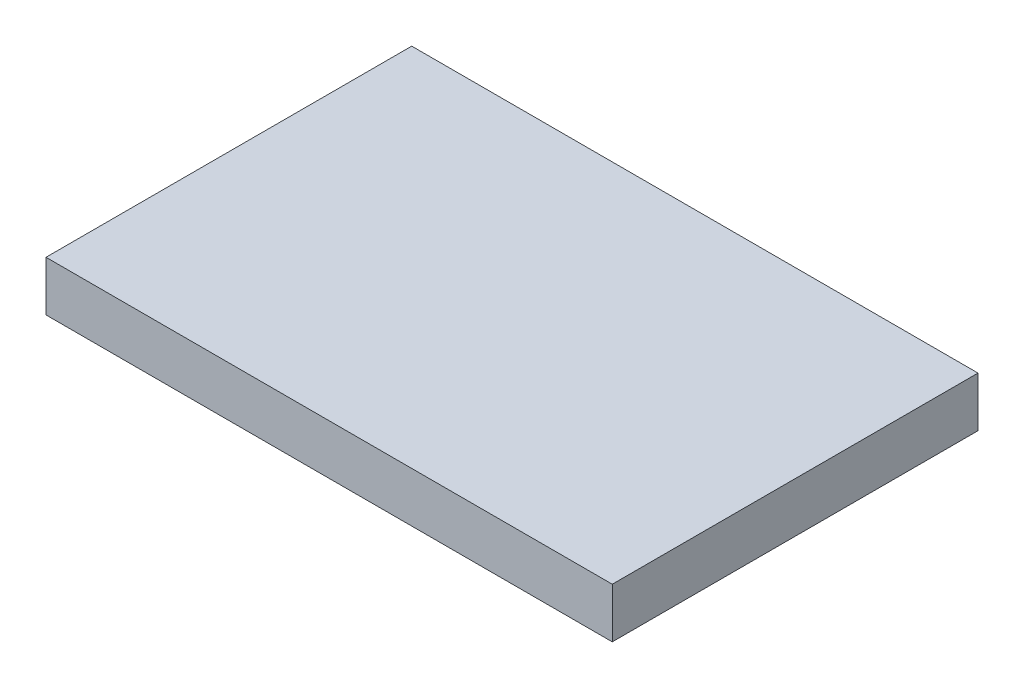
ISO-10303-21;
HEADER;
FILE_DESCRIPTION(('STEP AP214'),'2;1');
FILE_NAME('part.step','',(''),(''),'','','');
FILE_SCHEMA(('AUTOMOTIVE_DESIGN { 1 0 10303 214 1 1 1 1 }'));
ENDSEC;
DATA;
#1=APPLICATION_CONTEXT('core data for automotive mechanical design processes');
#2=APPLICATION_PROTOCOL_DEFINITION('international standard','automotive_design',2000,#1);
#3=PRODUCT_CONTEXT('',#1,'mechanical');
#4=PRODUCT('Part','Part','',(#3));
#5=PRODUCT_RELATED_PRODUCT_CATEGORY('part','',(#4));
#6=PRODUCT_DEFINITION_FORMATION('','',#4);
#7=PRODUCT_DEFINITION_CONTEXT('part definition',#1,'design');
#8=PRODUCT_DEFINITION('design','',#6,#7);
#9=PRODUCT_DEFINITION_SHAPE('','',#8);
#10=(LENGTH_UNIT() NAMED_UNIT(*) SI_UNIT(.MILLI.,.METRE.));
#11=(NAMED_UNIT(*) PLANE_ANGLE_UNIT() SI_UNIT($,.RADIAN.));
#12=(NAMED_UNIT(*) SI_UNIT($,.STERADIAN.) SOLID_ANGLE_UNIT());
#13=UNCERTAINTY_MEASURE_WITH_UNIT(LENGTH_MEASURE(1.E-05),#10,'distance_accuracy_value','');
#14=(GEOMETRIC_REPRESENTATION_CONTEXT(3) GLOBAL_UNCERTAINTY_ASSIGNED_CONTEXT((#13)) GLOBAL_UNIT_ASSIGNED_CONTEXT((#10,
#11,#12)) REPRESENTATION_CONTEXT('',''));
#15=CARTESIAN_POINT('',(0.,0.,0.));
#16=DIRECTION('',(0.,0.,1.));
#17=DIRECTION('',(1.,0.,0.));
#18=AXIS2_PLACEMENT_3D('',#15,#16,#17);
#19=CARTESIAN_POINT('',(0.,6.35,0.));
#20=DIRECTION('',(1.,0.,0.));
#21=DIRECTION('',(0.,0.,-1.));
#22=AXIS2_PLACEMENT_3D('',#19,#20,#21);
#23=PLANE('',#22);
#24=DIRECTION('',(0.,0.,1.));
#25=VECTOR('',#24,1.);
#26=CARTESIAN_POINT('',(0.,0.,0.));
#27=LINE('',#26,#25);
#28=CARTESIAN_POINT('',(0.,0.,-46.5));
#29=VERTEX_POINT('',#28);
#30=CARTESIAN_POINT('',(0.,0.,0.));
#31=VERTEX_POINT('',#30);
#32=EDGE_CURVE('E102',#29,#31,#27,.T.);
#33=ORIENTED_EDGE('',*,*,#32,.T.);
#34=DIRECTION('',(0.,-1.,0.));
#35=VECTOR('',#34,1.);
#36=CARTESIAN_POINT('',(0.,6.35,0.));
#37=LINE('',#36,#35);
#38=CARTESIAN_POINT('',(0.,6.35,0.));
#39=VERTEX_POINT('',#38);
#40=EDGE_CURVE('E11',#39,#31,#37,.T.);
#41=ORIENTED_EDGE('',*,*,#40,.F.);
#42=DIRECTION('',(0.,0.,1.));
#43=VECTOR('',#42,1.);
#44=CARTESIAN_POINT('',(0.,6.35,0.));
#45=LINE('',#44,#43);
#46=CARTESIAN_POINT('',(0.,6.35,-46.5));
#47=VERTEX_POINT('',#46);
#48=EDGE_CURVE('E90',#47,#39,#45,.T.);
#49=ORIENTED_EDGE('',*,*,#48,.F.);
#50=DIRECTION('',(0.,-1.,0.));
#51=VECTOR('',#50,1.);
#52=CARTESIAN_POINT('',(0.,6.35,-46.5));
#53=LINE('',#52,#51);
#54=EDGE_CURVE('E98',#47,#29,#53,.T.);
#55=ORIENTED_EDGE('',*,*,#54,.T.);
#56=EDGE_LOOP('',(#33,#41,#49,#55));
#57=FACE_BOUND('',#56,.T.);
#58=ADVANCED_FACE('F39',(#57),#23,.F.);
#59=CARTESIAN_POINT('',(0.,6.35,0.));
#60=DIRECTION('',(0.,0.,-1.));
#61=DIRECTION('',(-1.,0.,0.));
#62=AXIS2_PLACEMENT_3D('',#59,#60,#61);
#63=PLANE('',#62);
#64=DIRECTION('',(1.,0.,0.));
#65=VECTOR('',#64,1.);
#66=CARTESIAN_POINT('',(0.,0.,0.));
#67=LINE('',#66,#65);
#68=CARTESIAN_POINT('',(72.0000000000001,0.,0.));
#69=VERTEX_POINT('',#68);
#70=EDGE_CURVE('E94',#31,#69,#67,.T.);
#71=ORIENTED_EDGE('',*,*,#70,.T.);
#72=DIRECTION('',(0.,-1.,0.));
#73=VECTOR('',#72,1.);
#74=CARTESIAN_POINT('',(72.0000000000001,6.35,0.));
#75=LINE('',#74,#73);
#76=CARTESIAN_POINT('',(72.0000000000001,6.35,0.));
#77=VERTEX_POINT('',#76);
#78=EDGE_CURVE('E47',#77,#69,#75,.T.);
#79=ORIENTED_EDGE('',*,*,#78,.F.);
#80=DIRECTION('',(1.,0.,0.));
#81=VECTOR('',#80,1.);
#82=CARTESIAN_POINT('',(0.,6.35,0.));
#83=LINE('',#82,#81);
#84=EDGE_CURVE('E85',#39,#77,#83,.T.);
#85=ORIENTED_EDGE('',*,*,#84,.F.);
#86=ORIENTED_EDGE('',*,*,#40,.T.);
#87=EDGE_LOOP('',(#71,#79,#85,#86));
#88=FACE_BOUND('',#87,.T.);
#89=ADVANCED_FACE('F93',(#88),#63,.F.);
#90=CARTESIAN_POINT('',(72.0000000000001,6.35,0.));
#91=DIRECTION('',(-1.,0.,0.));
#92=DIRECTION('',(0.,0.,1.));
#93=AXIS2_PLACEMENT_3D('',#90,#91,#92);
#94=PLANE('',#93);
#95=DIRECTION('',(0.,0.,-1.));
#96=VECTOR('',#95,1.);
#97=CARTESIAN_POINT('',(72.0000000000001,0.,0.));
#98=LINE('',#97,#96);
#99=CARTESIAN_POINT('',(72.0000000000001,0.,-46.5));
#100=VERTEX_POINT('',#99);
#101=EDGE_CURVE('E72',#69,#100,#98,.T.);
#102=ORIENTED_EDGE('',*,*,#101,.T.);
#103=DIRECTION('',(0.,-1.,0.));
#104=VECTOR('',#103,1.);
#105=CARTESIAN_POINT('',(72.0000000000001,6.35,-46.5));
#106=LINE('',#105,#104);
#107=CARTESIAN_POINT('',(72.0000000000001,6.35,-46.5));
#108=VERTEX_POINT('',#107);
#109=EDGE_CURVE('E95',#108,#100,#106,.T.);
#110=ORIENTED_EDGE('',*,*,#109,.F.);
#111=DIRECTION('',(0.,0.,-1.));
#112=VECTOR('',#111,1.);
#113=CARTESIAN_POINT('',(72.0000000000001,6.35,0.));
#114=LINE('',#113,#112);
#115=EDGE_CURVE('E88',#77,#108,#114,.T.);
#116=ORIENTED_EDGE('',*,*,#115,.F.);
#117=ORIENTED_EDGE('',*,*,#78,.T.);
#118=EDGE_LOOP('',(#102,#110,#116,#117));
#119=FACE_BOUND('',#118,.T.);
#120=ADVANCED_FACE('F96',(#119),#94,.F.);
#121=CARTESIAN_POINT('',(0.,6.35,-46.5));
#122=DIRECTION('',(0.,0.,1.));
#123=DIRECTION('',(1.,0.,0.));
#124=AXIS2_PLACEMENT_3D('',#121,#122,#123);
#125=PLANE('',#124);
#126=DIRECTION('',(-1.,0.,0.));
#127=VECTOR('',#126,1.);
#128=CARTESIAN_POINT('',(0.,0.,-46.5));
#129=LINE('',#128,#127);
#130=EDGE_CURVE('E78',#100,#29,#129,.T.);
#131=ORIENTED_EDGE('',*,*,#130,.T.);
#132=ORIENTED_EDGE('',*,*,#54,.F.);
#133=DIRECTION('',(-1.,0.,0.));
#134=VECTOR('',#133,1.);
#135=CARTESIAN_POINT('',(0.,6.35,-46.5));
#136=LINE('',#135,#134);
#137=EDGE_CURVE('E55',#108,#47,#136,.T.);
#138=ORIENTED_EDGE('',*,*,#137,.F.);
#139=ORIENTED_EDGE('',*,*,#109,.T.);
#140=EDGE_LOOP('',(#131,#132,#138,#139));
#141=FACE_BOUND('',#140,.T.);
#142=ADVANCED_FACE('F109',(#141),#125,.F.);
#143=CARTESIAN_POINT('',(0.,6.35,0.));
#144=DIRECTION('',(0.,-1.,0.));
#145=DIRECTION('',(0.,0.,-1.));
#146=AXIS2_PLACEMENT_3D('',#143,#144,#145);
#147=PLANE('',#146);
#148=ORIENTED_EDGE('',*,*,#48,.T.);
#149=ORIENTED_EDGE('',*,*,#84,.T.);
#150=ORIENTED_EDGE('',*,*,#115,.T.);
#151=ORIENTED_EDGE('',*,*,#137,.T.);
#152=EDGE_LOOP('',(#148,#149,#150,#151));
#153=FACE_BOUND('',#152,.T.);
#154=ADVANCED_FACE('F86',(#153),#147,.F.);
#155=CARTESIAN_POINT('',(0.,0.,0.));
#156=DIRECTION('',(0.,-1.,0.));
#157=DIRECTION('',(0.,0.,-1.));
#158=AXIS2_PLACEMENT_3D('',#155,#156,#157);
#159=PLANE('',#158);
#160=ORIENTED_EDGE('',*,*,#32,.F.);
#161=ORIENTED_EDGE('',*,*,#130,.F.);
#162=ORIENTED_EDGE('',*,*,#101,.F.);
#163=ORIENTED_EDGE('',*,*,#70,.F.);
#164=EDGE_LOOP('',(#160,#161,#162,#163));
#165=FACE_BOUND('',#164,.T.);
#166=ADVANCED_FACE('F112',(#165),#159,.T.);
#167=CLOSED_SHELL('',(#58,#89,#120,#142,#154,#166));
#168=MANIFOLD_SOLID_BREP('B2',#167);
#169=ADVANCED_BREP_SHAPE_REPRESENTATION('',(#18,#168),#14);
#170=SHAPE_DEFINITION_REPRESENTATION(#9,#169);
ENDSEC;
END-ISO-10303-21;
